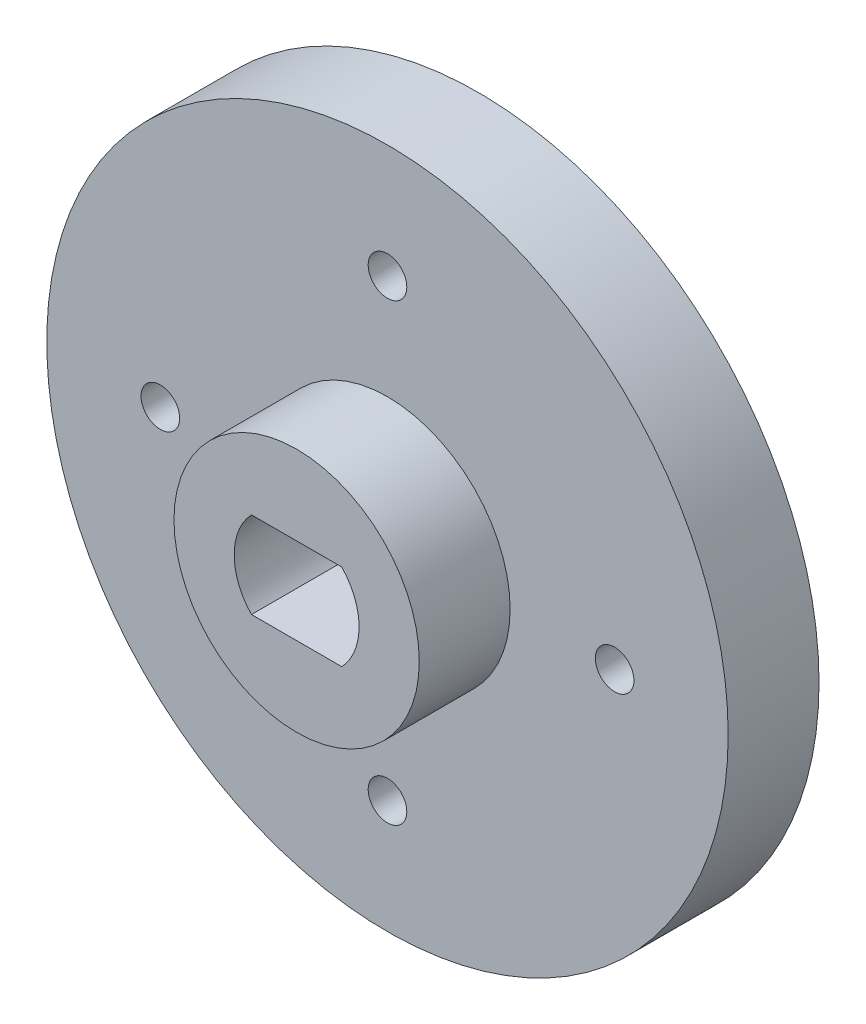
ISO-10303-21;
HEADER;
FILE_DESCRIPTION(('STEP AP214'),'2;1');
FILE_NAME('part.step','',(''),(''),'','','');
FILE_SCHEMA(('AUTOMOTIVE_DESIGN { 1 0 10303 214 1 1 1 1 }'));
ENDSEC;
DATA;
#1=APPLICATION_CONTEXT('core data for automotive mechanical design processes');
#2=APPLICATION_PROTOCOL_DEFINITION('international standard','automotive_design',2000,#1);
#3=PRODUCT_CONTEXT('',#1,'mechanical');
#4=PRODUCT('Part','Part','',(#3));
#5=PRODUCT_RELATED_PRODUCT_CATEGORY('part','',(#4));
#6=PRODUCT_DEFINITION_FORMATION('','',#4);
#7=PRODUCT_DEFINITION_CONTEXT('part definition',#1,'design');
#8=PRODUCT_DEFINITION('design','',#6,#7);
#9=PRODUCT_DEFINITION_SHAPE('','',#8);
#10=(LENGTH_UNIT() NAMED_UNIT(*) SI_UNIT(.MILLI.,.METRE.));
#11=(NAMED_UNIT(*) PLANE_ANGLE_UNIT() SI_UNIT($,.RADIAN.));
#12=(NAMED_UNIT(*) SI_UNIT($,.STERADIAN.) SOLID_ANGLE_UNIT());
#13=UNCERTAINTY_MEASURE_WITH_UNIT(LENGTH_MEASURE(1.E-05),#10,'distance_accuracy_value','');
#14=(GEOMETRIC_REPRESENTATION_CONTEXT(3) GLOBAL_UNCERTAINTY_ASSIGNED_CONTEXT((#13)) GLOBAL_UNIT_ASSIGNED_CONTEXT((#10,
#11,#12)) REPRESENTATION_CONTEXT('',''));
#15=CARTESIAN_POINT('',(0.,0.,0.));
#16=DIRECTION('',(0.,0.,1.));
#17=DIRECTION('',(1.,0.,0.));
#18=AXIS2_PLACEMENT_3D('',#15,#16,#17);
#19=CARTESIAN_POINT('',(0.,0.,5.08));
#20=DIRECTION('',(0.,0.,1.));
#21=DIRECTION('',(1.,0.,0.));
#22=AXIS2_PLACEMENT_3D('',#19,#20,#21);
#23=PLANE('',#22);
#24=CARTESIAN_POINT('',(0.,0.,5.08));
#25=DIRECTION('',(0.,0.,-1.));
#26=DIRECTION('',(-1.,0.,0.));
#27=AXIS2_PLACEMENT_3D('',#24,#25,#26);
#28=CIRCLE('',#27,0.879983);
#29=CARTESIAN_POINT('',(0.879983,0.,5.08));
#30=VERTEX_POINT('',#29);
#31=EDGE_CURVE('E136',#30,#30,#28,.T.);
#32=ORIENTED_EDGE('',*,*,#31,.T.);
#33=EDGE_LOOP('',(#32));
#34=FACE_BOUND('',#33,.T.);
#35=CARTESIAN_POINT('',(0.,0.,5.08));
#36=DIRECTION('',(0.,0.,1.));
#37=DIRECTION('',(-0.72294164916622,0.690909090909091,0.));
#38=AXIS2_PLACEMENT_3D('',#35,#36,#37);
#39=CIRCLE('',#38,3.4925);
#40=CARTESIAN_POINT('',(-2.52487370971303,2.413,5.08));
#41=VERTEX_POINT('',#40);
#42=CARTESIAN_POINT('',(-2.52487370971303,-2.413,5.08));
#43=VERTEX_POINT('',#42);
#44=EDGE_CURVE('E114',#41,#43,#39,.T.);
#45=ORIENTED_EDGE('',*,*,#44,.T.);
#46=DIRECTION('',(1.,0.,0.));
#47=VECTOR('',#46,1.);
#48=CARTESIAN_POINT('',(0.,-2.413,5.08));
#49=LINE('',#48,#47);
#50=CARTESIAN_POINT('',(2.52487370971303,-2.413,5.08));
#51=VERTEX_POINT('',#50);
#52=EDGE_CURVE('E98',#43,#51,#49,.T.);
#53=ORIENTED_EDGE('',*,*,#52,.T.);
#54=CARTESIAN_POINT('',(0.,0.,5.08));
#55=DIRECTION('',(0.,0.,1.));
#56=DIRECTION('',(0.72294164916622,-0.690909090909091,0.));
#57=AXIS2_PLACEMENT_3D('',#54,#55,#56);
#58=CIRCLE('',#57,3.4925);
#59=CARTESIAN_POINT('',(2.52487370971303,2.413,5.08));
#60=VERTEX_POINT('',#59);
#61=EDGE_CURVE('E138',#51,#60,#58,.T.);
#62=ORIENTED_EDGE('',*,*,#61,.T.);
#63=DIRECTION('',(-1.,0.,0.));
#64=VECTOR('',#63,1.);
#65=CARTESIAN_POINT('',(1.26243685485651,2.413,5.08));
#66=LINE('',#65,#64);
#67=EDGE_CURVE('E118',#60,#41,#66,.T.);
#68=ORIENTED_EDGE('',*,*,#67,.T.);
#69=EDGE_LOOP('',(#45,#53,#62,#68));
#70=FACE_BOUND('',#69,.T.);
#71=ADVANCED_FACE('F15',(#34,#70),#23,.T.);
#72=CARTESIAN_POINT('',(0.,0.,0.));
#73=DIRECTION('',(0.,0.,1.));
#74=DIRECTION('',(1.,0.,0.));
#75=AXIS2_PLACEMENT_3D('',#72,#73,#74);
#76=PLANE('',#75);
#77=CARTESIAN_POINT('',(0.,0.,0.));
#78=DIRECTION('',(0.,0.,-1.));
#79=DIRECTION('',(-1.,0.,0.));
#80=AXIS2_PLACEMENT_3D('',#77,#78,#79);
#81=CIRCLE('',#80,19.05);
#82=CARTESIAN_POINT('',(19.05,0.,0.));
#83=VERTEX_POINT('',#82);
#84=EDGE_CURVE('E10',#83,#83,#81,.T.);
#85=ORIENTED_EDGE('',*,*,#84,.T.);
#86=EDGE_LOOP('',(#85));
#87=FACE_BOUND('',#86,.T.);
#88=CARTESIAN_POINT('',(0.,0.,0.));
#89=DIRECTION('',(0.,0.,1.));
#90=DIRECTION('',(-1.,0.,0.));
#91=AXIS2_PLACEMENT_3D('',#88,#89,#90);
#92=CIRCLE('',#91,0.879983);
#93=CARTESIAN_POINT('',(0.879983,0.,0.));
#94=VERTEX_POINT('',#93);
#95=EDGE_CURVE('E26',#94,#94,#92,.T.);
#96=ORIENTED_EDGE('',*,*,#95,.T.);
#97=EDGE_LOOP('',(#96));
#98=FACE_BOUND('',#97,.T.);
#99=CARTESIAN_POINT('',(0.,-12.7,0.));
#100=DIRECTION('',(0.,0.,1.));
#101=DIRECTION('',(-1.,0.,0.));
#102=AXIS2_PLACEMENT_3D('',#99,#100,#101);
#103=CIRCLE('',#102,1.0795);
#104=CARTESIAN_POINT('',(-1.0795,-12.7,0.));
#105=VERTEX_POINT('',#104);
#106=EDGE_CURVE('E123',#105,#105,#103,.T.);
#107=ORIENTED_EDGE('',*,*,#106,.T.);
#108=EDGE_LOOP('',(#107));
#109=FACE_BOUND('',#108,.T.);
#110=CARTESIAN_POINT('',(0.,12.7,0.));
#111=DIRECTION('',(0.,0.,1.));
#112=DIRECTION('',(-1.,0.,0.));
#113=AXIS2_PLACEMENT_3D('',#110,#111,#112);
#114=CIRCLE('',#113,1.0795);
#115=CARTESIAN_POINT('',(-1.0795,12.7,0.));
#116=VERTEX_POINT('',#115);
#117=EDGE_CURVE('E86',#116,#116,#114,.T.);
#118=ORIENTED_EDGE('',*,*,#117,.T.);
#119=EDGE_LOOP('',(#118));
#120=FACE_BOUND('',#119,.T.);
#121=CARTESIAN_POINT('',(-12.7,0.,0.));
#122=DIRECTION('',(0.,0.,1.));
#123=DIRECTION('',(-1.,0.,0.));
#124=AXIS2_PLACEMENT_3D('',#121,#122,#123);
#125=CIRCLE('',#124,1.0795);
#126=CARTESIAN_POINT('',(-13.7795,0.,0.));
#127=VERTEX_POINT('',#126);
#128=EDGE_CURVE('E131',#127,#127,#125,.T.);
#129=ORIENTED_EDGE('',*,*,#128,.T.);
#130=EDGE_LOOP('',(#129));
#131=FACE_BOUND('',#130,.T.);
#132=CARTESIAN_POINT('',(12.7,0.,0.));
#133=DIRECTION('',(0.,0.,1.));
#134=DIRECTION('',(-1.,0.,0.));
#135=AXIS2_PLACEMENT_3D('',#132,#133,#134);
#136=CIRCLE('',#135,1.0795);
#137=CARTESIAN_POINT('',(11.6205,0.,0.));
#138=VERTEX_POINT('',#137);
#139=EDGE_CURVE('E145',#138,#138,#136,.T.);
#140=ORIENTED_EDGE('',*,*,#139,.T.);
#141=EDGE_LOOP('',(#140));
#142=FACE_BOUND('',#141,.T.);
#143=ADVANCED_FACE('F184',(#87,#98,#109,#120,#131,#142),#76,.F.);
#144=CARTESIAN_POINT('',(0.,0.,0.));
#145=DIRECTION('',(0.,0.,-1.));
#146=DIRECTION('',(-1.,0.,0.));
#147=AXIS2_PLACEMENT_3D('',#144,#145,#146);
#148=CYLINDRICAL_SURFACE('',#147,19.05);
#149=ORIENTED_EDGE('',*,*,#84,.F.);
#150=EDGE_LOOP('',(#149));
#151=FACE_BOUND('',#150,.T.);
#152=CARTESIAN_POINT('',(0.,0.,5.08));
#153=DIRECTION('',(0.,0.,1.));
#154=DIRECTION('',(-1.,0.,0.));
#155=AXIS2_PLACEMENT_3D('',#152,#153,#154);
#156=CIRCLE('',#155,19.05);
#157=CARTESIAN_POINT('',(19.05,0.,5.08));
#158=VERTEX_POINT('',#157);
#159=EDGE_CURVE('E133',#158,#158,#156,.T.);
#160=ORIENTED_EDGE('',*,*,#159,.F.);
#161=EDGE_LOOP('',(#160));
#162=FACE_BOUND('',#161,.T.);
#163=ADVANCED_FACE('F190',(#151,#162),#148,.T.);
#164=CARTESIAN_POINT('',(0.,0.,0.));
#165=DIRECTION('',(0.,0.,-1.));
#166=DIRECTION('',(-1.,0.,0.));
#167=AXIS2_PLACEMENT_3D('',#164,#165,#166);
#168=CYLINDRICAL_SURFACE('',#167,0.879983);
#169=ORIENTED_EDGE('',*,*,#95,.F.);
#170=EDGE_LOOP('',(#169));
#171=FACE_BOUND('',#170,.T.);
#172=ORIENTED_EDGE('',*,*,#31,.F.);
#173=EDGE_LOOP('',(#172));
#174=FACE_BOUND('',#173,.T.);
#175=ADVANCED_FACE('F187',(#171,#174),#168,.F.);
#176=CARTESIAN_POINT('',(0.,0.,5.08));
#177=DIRECTION('',(0.,0.,1.));
#178=DIRECTION('',(1.,0.,0.));
#179=AXIS2_PLACEMENT_3D('',#176,#177,#178);
#180=PLANE('',#179);
#181=CARTESIAN_POINT('',(0.,0.,5.08));
#182=DIRECTION('',(0.,0.,-1.));
#183=DIRECTION('',(-1.,0.,0.));
#184=AXIS2_PLACEMENT_3D('',#181,#182,#183);
#185=CIRCLE('',#184,6.858);
#186=CARTESIAN_POINT('',(6.858,0.,5.08));
#187=VERTEX_POINT('',#186);
#188=EDGE_CURVE('E137',#187,#187,#185,.T.);
#189=ORIENTED_EDGE('',*,*,#188,.T.);
#190=EDGE_LOOP('',(#189));
#191=FACE_BOUND('',#190,.T.);
#192=ORIENTED_EDGE('',*,*,#159,.T.);
#193=EDGE_LOOP('',(#192));
#194=FACE_BOUND('',#193,.T.);
#195=CARTESIAN_POINT('',(0.,-12.7,5.08));
#196=DIRECTION('',(0.,0.,-1.));
#197=DIRECTION('',(-1.,0.,0.));
#198=AXIS2_PLACEMENT_3D('',#195,#196,#197);
#199=CIRCLE('',#198,1.0795);
#200=CARTESIAN_POINT('',(1.0795,-12.7,5.08));
#201=VERTEX_POINT('',#200);
#202=EDGE_CURVE('E127',#201,#201,#199,.T.);
#203=ORIENTED_EDGE('',*,*,#202,.T.);
#204=EDGE_LOOP('',(#203));
#205=FACE_BOUND('',#204,.T.);
#206=CARTESIAN_POINT('',(0.,12.7,5.08));
#207=DIRECTION('',(0.,0.,-1.));
#208=DIRECTION('',(-1.,0.,0.));
#209=AXIS2_PLACEMENT_3D('',#206,#207,#208);
#210=CIRCLE('',#209,1.0795);
#211=CARTESIAN_POINT('',(1.0795,12.7,5.08));
#212=VERTEX_POINT('',#211);
#213=EDGE_CURVE('E90',#212,#212,#210,.T.);
#214=ORIENTED_EDGE('',*,*,#213,.T.);
#215=EDGE_LOOP('',(#214));
#216=FACE_BOUND('',#215,.T.);
#217=CARTESIAN_POINT('',(-12.7,0.,5.08));
#218=DIRECTION('',(0.,0.,-1.));
#219=DIRECTION('',(-1.,0.,0.));
#220=AXIS2_PLACEMENT_3D('',#217,#218,#219);
#221=CIRCLE('',#220,1.0795);
#222=CARTESIAN_POINT('',(-11.6205,0.,5.08));
#223=VERTEX_POINT('',#222);
#224=EDGE_CURVE('E146',#223,#223,#221,.T.);
#225=ORIENTED_EDGE('',*,*,#224,.T.);
#226=EDGE_LOOP('',(#225));
#227=FACE_BOUND('',#226,.T.);
#228=CARTESIAN_POINT('',(12.7,0.,5.08));
#229=DIRECTION('',(0.,0.,-1.));
#230=DIRECTION('',(-1.,0.,0.));
#231=AXIS2_PLACEMENT_3D('',#228,#229,#230);
#232=CIRCLE('',#231,1.0795);
#233=CARTESIAN_POINT('',(13.7795,0.,5.08));
#234=VERTEX_POINT('',#233);
#235=EDGE_CURVE('E147',#234,#234,#232,.T.);
#236=ORIENTED_EDGE('',*,*,#235,.T.);
#237=EDGE_LOOP('',(#236));
#238=FACE_BOUND('',#237,.T.);
#239=ADVANCED_FACE('F17',(#191,#194,#205,#216,#227,#238),#180,.T.);
#240=CARTESIAN_POINT('',(0.,0.,10.16));
#241=DIRECTION('',(0.,0.,1.));
#242=DIRECTION('',(1.,0.,0.));
#243=AXIS2_PLACEMENT_3D('',#240,#241,#242);
#244=PLANE('',#243);
#245=CARTESIAN_POINT('',(0.,0.,10.16));
#246=DIRECTION('',(0.,0.,1.));
#247=DIRECTION('',(-1.,0.,0.));
#248=AXIS2_PLACEMENT_3D('',#245,#246,#247);
#249=CIRCLE('',#248,6.858);
#250=CARTESIAN_POINT('',(6.858,0.,10.16));
#251=VERTEX_POINT('',#250);
#252=EDGE_CURVE('E173',#251,#251,#249,.T.);
#253=ORIENTED_EDGE('',*,*,#252,.T.);
#254=EDGE_LOOP('',(#253));
#255=FACE_BOUND('',#254,.T.);
#256=CARTESIAN_POINT('',(0.,0.,10.16));
#257=DIRECTION('',(0.,0.,-1.));
#258=DIRECTION('',(-0.72294164916622,0.690909090909091,0.));
#259=AXIS2_PLACEMENT_3D('',#256,#257,#258);
#260=CIRCLE('',#259,3.4925);
#261=CARTESIAN_POINT('',(-2.52487370971303,-2.413,10.16));
#262=VERTEX_POINT('',#261);
#263=CARTESIAN_POINT('',(-2.52487370971303,2.413,10.16));
#264=VERTEX_POINT('',#263);
#265=EDGE_CURVE('E116',#262,#264,#260,.T.);
#266=ORIENTED_EDGE('',*,*,#265,.T.);
#267=DIRECTION('',(1.,0.,0.));
#268=VECTOR('',#267,1.);
#269=CARTESIAN_POINT('',(1.26243685485651,2.413,10.16));
#270=LINE('',#269,#268);
#271=CARTESIAN_POINT('',(2.52487370971303,2.413,10.16));
#272=VERTEX_POINT('',#271);
#273=EDGE_CURVE('E139',#264,#272,#270,.T.);
#274=ORIENTED_EDGE('',*,*,#273,.T.);
#275=CARTESIAN_POINT('',(0.,0.,10.16));
#276=DIRECTION('',(0.,0.,-1.));
#277=DIRECTION('',(0.72294164916622,-0.690909090909091,0.));
#278=AXIS2_PLACEMENT_3D('',#275,#276,#277);
#279=CIRCLE('',#278,3.4925);
#280=CARTESIAN_POINT('',(2.52487370971303,-2.413,10.16));
#281=VERTEX_POINT('',#280);
#282=EDGE_CURVE('E108',#272,#281,#279,.T.);
#283=ORIENTED_EDGE('',*,*,#282,.T.);
#284=DIRECTION('',(-1.,0.,0.));
#285=VECTOR('',#284,1.);
#286=CARTESIAN_POINT('',(0.,-2.413,10.16));
#287=LINE('',#286,#285);
#288=EDGE_CURVE('E107',#281,#262,#287,.T.);
#289=ORIENTED_EDGE('',*,*,#288,.T.);
#290=EDGE_LOOP('',(#266,#274,#283,#289));
#291=FACE_BOUND('',#290,.T.);
#292=ADVANCED_FACE('F231',(#255,#291),#244,.T.);
#293=CARTESIAN_POINT('',(0.,0.,5.08));
#294=DIRECTION('',(0.,0.,-1.));
#295=DIRECTION('',(-1.,0.,0.));
#296=AXIS2_PLACEMENT_3D('',#293,#294,#295);
#297=CYLINDRICAL_SURFACE('',#296,6.858);
#298=ORIENTED_EDGE('',*,*,#188,.F.);
#299=EDGE_LOOP('',(#298));
#300=FACE_BOUND('',#299,.T.);
#301=ORIENTED_EDGE('',*,*,#252,.F.);
#302=EDGE_LOOP('',(#301));
#303=FACE_BOUND('',#302,.T.);
#304=ADVANCED_FACE('F228',(#300,#303),#297,.T.);
#305=CARTESIAN_POINT('',(0.,-2.413,5.08));
#306=DIRECTION('',(0.,-1.,0.));
#307=DIRECTION('',(1.,0.,0.));
#308=AXIS2_PLACEMENT_3D('',#305,#306,#307);
#309=PLANE('',#308);
#310=ORIENTED_EDGE('',*,*,#52,.F.);
#311=DIRECTION('',(0.,0.,1.));
#312=VECTOR('',#311,1.);
#313=CARTESIAN_POINT('',(-2.52487370971303,-2.413,5.08));
#314=LINE('',#313,#312);
#315=EDGE_CURVE('E101',#43,#262,#314,.T.);
#316=ORIENTED_EDGE('',*,*,#315,.T.);
#317=ORIENTED_EDGE('',*,*,#288,.F.);
#318=DIRECTION('',(0.,0.,1.));
#319=VECTOR('',#318,1.);
#320=CARTESIAN_POINT('',(2.52487370971303,-2.413,5.08));
#321=LINE('',#320,#319);
#322=EDGE_CURVE('E19',#51,#281,#321,.T.);
#323=ORIENTED_EDGE('',*,*,#322,.F.);
#324=EDGE_LOOP('',(#310,#316,#317,#323));
#325=FACE_BOUND('',#324,.T.);
#326=ADVANCED_FACE('F100',(#325),#309,.F.);
#327=CARTESIAN_POINT('',(0.,0.,5.08));
#328=DIRECTION('',(0.,0.,-1.));
#329=DIRECTION('',(0.72294164916622,-0.690909090909091,0.));
#330=AXIS2_PLACEMENT_3D('',#327,#328,#329);
#331=CYLINDRICAL_SURFACE('',#330,3.4925);
#332=ORIENTED_EDGE('',*,*,#61,.F.);
#333=ORIENTED_EDGE('',*,*,#322,.T.);
#334=ORIENTED_EDGE('',*,*,#282,.F.);
#335=DIRECTION('',(0.,0.,1.));
#336=VECTOR('',#335,1.);
#337=CARTESIAN_POINT('',(2.52487370971303,2.413,5.08));
#338=LINE('',#337,#336);
#339=EDGE_CURVE('E155',#60,#272,#338,.T.);
#340=ORIENTED_EDGE('',*,*,#339,.F.);
#341=EDGE_LOOP('',(#332,#333,#334,#340));
#342=FACE_BOUND('',#341,.T.);
#343=ADVANCED_FACE('F165',(#342),#331,.F.);
#344=CARTESIAN_POINT('',(2.52487370971303,2.413,5.08));
#345=DIRECTION('',(0.,1.,0.));
#346=DIRECTION('',(-1.,0.,0.));
#347=AXIS2_PLACEMENT_3D('',#344,#345,#346);
#348=PLANE('',#347);
#349=ORIENTED_EDGE('',*,*,#67,.F.);
#350=ORIENTED_EDGE('',*,*,#339,.T.);
#351=ORIENTED_EDGE('',*,*,#273,.F.);
#352=DIRECTION('',(0.,0.,1.));
#353=VECTOR('',#352,1.);
#354=CARTESIAN_POINT('',(-2.52487370971303,2.413,5.08));
#355=LINE('',#354,#353);
#356=EDGE_CURVE('E122',#41,#264,#355,.T.);
#357=ORIENTED_EDGE('',*,*,#356,.F.);
#358=EDGE_LOOP('',(#349,#350,#351,#357));
#359=FACE_BOUND('',#358,.T.);
#360=ADVANCED_FACE('F170',(#359),#348,.F.);
#361=CARTESIAN_POINT('',(0.,0.,5.08));
#362=DIRECTION('',(0.,0.,-1.));
#363=DIRECTION('',(-0.72294164916622,0.690909090909091,0.));
#364=AXIS2_PLACEMENT_3D('',#361,#362,#363);
#365=CYLINDRICAL_SURFACE('',#364,3.4925);
#366=ORIENTED_EDGE('',*,*,#44,.F.);
#367=ORIENTED_EDGE('',*,*,#356,.T.);
#368=ORIENTED_EDGE('',*,*,#265,.F.);
#369=ORIENTED_EDGE('',*,*,#315,.F.);
#370=EDGE_LOOP('',(#366,#367,#368,#369));
#371=FACE_BOUND('',#370,.T.);
#372=ADVANCED_FACE('F112',(#371),#365,.F.);
#373=CARTESIAN_POINT('',(0.,-12.7,54.8310641881042));
#374=DIRECTION('',(0.,0.,1.));
#375=DIRECTION('',(-1.,0.,0.));
#376=AXIS2_PLACEMENT_3D('',#373,#374,#375);
#377=CYLINDRICAL_SURFACE('',#376,1.0795);
#378=ORIENTED_EDGE('',*,*,#106,.F.);
#379=EDGE_LOOP('',(#378));
#380=FACE_BOUND('',#379,.T.);
#381=ORIENTED_EDGE('',*,*,#202,.F.);
#382=EDGE_LOOP('',(#381));
#383=FACE_BOUND('',#382,.T.);
#384=ADVANCED_FACE('F203',(#380,#383),#377,.F.);
#385=CARTESIAN_POINT('',(0.,12.7,54.8310641881042));
#386=DIRECTION('',(0.,0.,1.));
#387=DIRECTION('',(-1.,0.,0.));
#388=AXIS2_PLACEMENT_3D('',#385,#386,#387);
#389=CYLINDRICAL_SURFACE('',#388,1.0795);
#390=ORIENTED_EDGE('',*,*,#117,.F.);
#391=EDGE_LOOP('',(#390));
#392=FACE_BOUND('',#391,.T.);
#393=ORIENTED_EDGE('',*,*,#213,.F.);
#394=EDGE_LOOP('',(#393));
#395=FACE_BOUND('',#394,.T.);
#396=ADVANCED_FACE('F205',(#392,#395),#389,.F.);
#397=CARTESIAN_POINT('',(-12.7,0.,54.8310641881042));
#398=DIRECTION('',(0.,0.,1.));
#399=DIRECTION('',(-1.,0.,0.));
#400=AXIS2_PLACEMENT_3D('',#397,#398,#399);
#401=CYLINDRICAL_SURFACE('',#400,1.0795);
#402=ORIENTED_EDGE('',*,*,#128,.F.);
#403=EDGE_LOOP('',(#402));
#404=FACE_BOUND('',#403,.T.);
#405=ORIENTED_EDGE('',*,*,#224,.F.);
#406=EDGE_LOOP('',(#405));
#407=FACE_BOUND('',#406,.T.);
#408=ADVANCED_FACE('F216',(#404,#407),#401,.F.);
#409=CARTESIAN_POINT('',(12.7,0.,54.8310641881042));
#410=DIRECTION('',(0.,0.,1.));
#411=DIRECTION('',(-1.,0.,0.));
#412=AXIS2_PLACEMENT_3D('',#409,#410,#411);
#413=CYLINDRICAL_SURFACE('',#412,1.0795);
#414=ORIENTED_EDGE('',*,*,#139,.F.);
#415=EDGE_LOOP('',(#414));
#416=FACE_BOUND('',#415,.T.);
#417=ORIENTED_EDGE('',*,*,#235,.F.);
#418=EDGE_LOOP('',(#417));
#419=FACE_BOUND('',#418,.T.);
#420=ADVANCED_FACE('F213',(#416,#419),#413,.F.);
#421=CLOSED_SHELL('',(#71,#143,#163,#175,#239,#292,#304,#326,#343,#360,#372,#384,#396,#408,#420));
#422=MANIFOLD_SOLID_BREP('B1',#421);
#423=ADVANCED_BREP_SHAPE_REPRESENTATION('',(#18,#422),#14);
#424=SHAPE_DEFINITION_REPRESENTATION(#9,#423);
ENDSEC;
END-ISO-10303-21;
